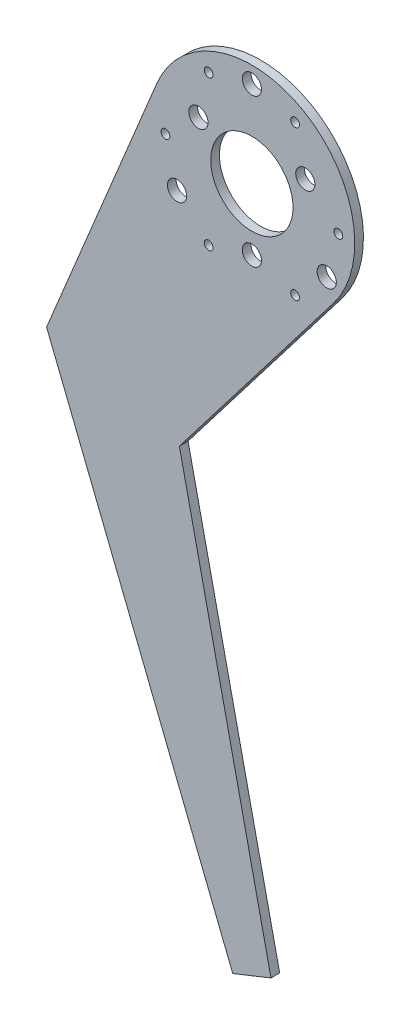
ISO-10303-21;
HEADER;
FILE_DESCRIPTION(('STEP AP214'),'2;1');
FILE_NAME('part.step','',(''),(''),'','','');
FILE_SCHEMA(('AUTOMOTIVE_DESIGN { 1 0 10303 214 1 1 1 1 }'));
ENDSEC;
DATA;
#1=APPLICATION_CONTEXT('core data for automotive mechanical design processes');
#2=APPLICATION_PROTOCOL_DEFINITION('international standard','automotive_design',2000,#1);
#3=PRODUCT_CONTEXT('',#1,'mechanical');
#4=PRODUCT('Part','Part','',(#3));
#5=PRODUCT_RELATED_PRODUCT_CATEGORY('part','',(#4));
#6=PRODUCT_DEFINITION_FORMATION('','',#4);
#7=PRODUCT_DEFINITION_CONTEXT('part definition',#1,'design');
#8=PRODUCT_DEFINITION('design','',#6,#7);
#9=PRODUCT_DEFINITION_SHAPE('','',#8);
#10=(LENGTH_UNIT() NAMED_UNIT(*) SI_UNIT(.MILLI.,.METRE.));
#11=(NAMED_UNIT(*) PLANE_ANGLE_UNIT() SI_UNIT($,.RADIAN.));
#12=(NAMED_UNIT(*) SI_UNIT($,.STERADIAN.) SOLID_ANGLE_UNIT());
#13=UNCERTAINTY_MEASURE_WITH_UNIT(LENGTH_MEASURE(1.E-05),#10,'distance_accuracy_value','');
#14=(GEOMETRIC_REPRESENTATION_CONTEXT(3) GLOBAL_UNCERTAINTY_ASSIGNED_CONTEXT((#13)) GLOBAL_UNIT_ASSIGNED_CONTEXT((#10,
#11,#12)) REPRESENTATION_CONTEXT('',''));
#15=CARTESIAN_POINT('',(0.,0.,0.));
#16=DIRECTION('',(0.,0.,1.));
#17=DIRECTION('',(1.,0.,0.));
#18=AXIS2_PLACEMENT_3D('',#15,#16,#17);
#19=CARTESIAN_POINT('',(0.,0.,7.35));
#20=DIRECTION('',(0.,0.,1.));
#21=DIRECTION('',(1.,0.,0.));
#22=AXIS2_PLACEMENT_3D('',#19,#20,#21);
#23=PLANE('',#22);
#24=CARTESIAN_POINT('',(27.2798002192098,-15.75,7.35));
#25=DIRECTION('',(0.,0.,1.));
#26=DIRECTION('',(1.,0.,0.));
#27=AXIS2_PLACEMENT_3D('',#24,#25,#26);
#28=CIRCLE('',#27,3.5);
#29=CARTESIAN_POINT('',(30.7798002192098,-15.75,7.35));
#30=VERTEX_POINT('',#29);
#31=EDGE_CURVE('E134',#30,#30,#28,.T.);
#32=ORIENTED_EDGE('',*,*,#31,.F.);
#33=EDGE_LOOP('',(#32));
#34=FACE_BOUND('',#33,.T.);
#35=CARTESIAN_POINT('',(-27.2798002192098,-15.75,7.35));
#36=DIRECTION('',(0.,0.,1.));
#37=DIRECTION('',(1.,0.,0.));
#38=AXIS2_PLACEMENT_3D('',#35,#36,#37);
#39=CIRCLE('',#38,3.5);
#40=CARTESIAN_POINT('',(-23.7798002192098,-15.75,7.35));
#41=VERTEX_POINT('',#40);
#42=EDGE_CURVE('E146',#41,#41,#39,.T.);
#43=ORIENTED_EDGE('',*,*,#42,.F.);
#44=EDGE_LOOP('',(#43));
#45=FACE_BOUND('',#44,.T.);
#46=CARTESIAN_POINT('',(0.,31.5,7.35));
#47=DIRECTION('',(0.,0.,1.));
#48=DIRECTION('',(1.,0.,0.));
#49=AXIS2_PLACEMENT_3D('',#46,#47,#48);
#50=CIRCLE('',#49,3.5);
#51=CARTESIAN_POINT('',(3.5,31.5,7.35));
#52=VERTEX_POINT('',#51);
#53=EDGE_CURVE('E158',#52,#52,#50,.T.);
#54=ORIENTED_EDGE('',*,*,#53,.F.);
#55=EDGE_LOOP('',(#54));
#56=FACE_BOUND('',#55,.T.);
#57=CARTESIAN_POINT('',(-31.5,0.,7.35));
#58=DIRECTION('',(0.,0.,1.));
#59=DIRECTION('',(1.,0.,0.));
#60=AXIS2_PLACEMENT_3D('',#57,#58,#59);
#61=CIRCLE('',#60,1.59999999999999);
#62=CARTESIAN_POINT('',(-29.9,0.,7.35));
#63=VERTEX_POINT('',#62);
#64=EDGE_CURVE('E170',#63,#63,#61,.T.);
#65=ORIENTED_EDGE('',*,*,#64,.F.);
#66=EDGE_LOOP('',(#65));
#67=FACE_BOUND('',#66,.T.);
#68=CARTESIAN_POINT('',(15.75,27.2798002192098,7.35));
#69=DIRECTION('',(0.,0.,1.));
#70=DIRECTION('',(1.,0.,0.));
#71=AXIS2_PLACEMENT_3D('',#68,#69,#70);
#72=CIRCLE('',#71,1.60000000000016);
#73=CARTESIAN_POINT('',(17.3500000000002,27.2798002192098,7.35));
#74=VERTEX_POINT('',#73);
#75=EDGE_CURVE('E182',#74,#74,#72,.T.);
#76=ORIENTED_EDGE('',*,*,#75,.F.);
#77=EDGE_LOOP('',(#76));
#78=FACE_BOUND('',#77,.T.);
#79=CARTESIAN_POINT('',(15.75,-27.2798002192098,7.35));
#80=DIRECTION('',(0.,0.,1.));
#81=DIRECTION('',(1.,0.,0.));
#82=AXIS2_PLACEMENT_3D('',#79,#80,#81);
#83=CIRCLE('',#82,1.60000000000004);
#84=CARTESIAN_POINT('',(17.35,-27.2798002192098,7.35));
#85=VERTEX_POINT('',#84);
#86=EDGE_CURVE('E194',#85,#85,#83,.T.);
#87=ORIENTED_EDGE('',*,*,#86,.F.);
#88=EDGE_LOOP('',(#87));
#89=FACE_BOUND('',#88,.T.);
#90=CARTESIAN_POINT('',(0.,0.,7.35));
#91=DIRECTION('',(0.,0.,1.));
#92=DIRECTION('',(1.,0.,0.));
#93=AXIS2_PLACEMENT_3D('',#90,#91,#92);
#94=CIRCLE('',#93,37.5);
#95=CARTESIAN_POINT('',(29.7507502609214,-22.828553587827,7.35));
#96=VERTEX_POINT('',#95);
#97=CARTESIAN_POINT('',(-34.6454824691732,14.350628713691,7.35));
#98=VERTEX_POINT('',#97);
#99=EDGE_CURVE('E11',#96,#98,#94,.T.);
#100=ORIENTED_EDGE('',*,*,#99,.T.);
#101=DIRECTION('',(-0.382683432365094,-0.923879532511285,0.));
#102=VECTOR('',#101,1.);
#103=CARTESIAN_POINT('',(-34.6454824691732,14.350628713691,7.35));
#104=LINE('',#103,#102);
#105=CARTESIAN_POINT('',(-74.827242867508,-82.6567221999939,7.35));
#106=VERTEX_POINT('',#105);
#107=EDGE_CURVE('E88',#98,#106,#104,.T.);
#108=ORIENTED_EDGE('',*,*,#107,.T.);
#109=DIRECTION('',(0.370506532215965,-0.928829860407868,0.));
#110=VECTOR('',#109,1.);
#111=CARTESIAN_POINT('',(-74.827242867508,-82.6567221999939,7.35));
#112=LINE('',#111,#110);
#113=CARTESIAN_POINT('',(-6.96622395305898,-252.77879899162,7.35));
#114=VERTEX_POINT('',#113);
#115=EDGE_CURVE('E96',#106,#114,#112,.T.);
#116=ORIENTED_EDGE('',*,*,#115,.T.);
#117=DIRECTION('',(0.928829860407877,0.370506532215943,0.));
#118=VECTOR('',#117,1.);
#119=CARTESIAN_POINT('',(-6.96622395305898,-252.77879899162,7.35));
#120=LINE('',#119,#118);
#121=CARTESIAN_POINT('',(6.96622395305914,-247.221201008381,7.35));
#122=VERTEX_POINT('',#121);
#123=EDGE_CURVE('E102',#114,#122,#120,.T.);
#124=ORIENTED_EDGE('',*,*,#123,.T.);
#125=DIRECTION('',(-0.215665843950661,0.976467226154083,0.));
#126=VECTOR('',#125,1.);
#127=CARTESIAN_POINT('',(6.96622395305914,-247.221201008381,7.35));
#128=LINE('',#127,#126);
#129=CARTESIAN_POINT('',(-26.4246581212801,-96.0377711212288,7.35));
#130=VERTEX_POINT('',#129);
#131=EDGE_CURVE('E112',#122,#130,#128,.T.);
#132=ORIENTED_EDGE('',*,*,#131,.T.);
#133=DIRECTION('',(0.608761429008719,0.793353340291236,0.));
#134=VECTOR('',#133,1.);
#135=CARTESIAN_POINT('',(-26.4246581212801,-96.0377711212288,7.35));
#136=LINE('',#135,#134);
#137=EDGE_CURVE('E115',#130,#96,#136,.T.);
#138=ORIENTED_EDGE('',*,*,#137,.T.);
#139=EDGE_LOOP('',(#100,#108,#116,#124,#132,#138));
#140=FACE_BOUND('',#139,.T.);
#141=CARTESIAN_POINT('',(0.,0.,7.35));
#142=DIRECTION('',(0.,0.,1.));
#143=DIRECTION('',(1.,0.,0.));
#144=AXIS2_PLACEMENT_3D('',#141,#142,#143);
#145=CIRCLE('',#144,15.);
#146=CARTESIAN_POINT('',(15.,0.,7.35));
#147=VERTEX_POINT('',#146);
#148=EDGE_CURVE('E200',#147,#147,#145,.T.);
#149=ORIENTED_EDGE('',*,*,#148,.F.);
#150=EDGE_LOOP('',(#149));
#151=FACE_BOUND('',#150,.T.);
#152=CARTESIAN_POINT('',(31.5,0.,7.35));
#153=DIRECTION('',(0.,0.,1.));
#154=DIRECTION('',(1.,0.,0.));
#155=AXIS2_PLACEMENT_3D('',#152,#153,#154);
#156=CIRCLE('',#155,1.5999999999999);
#157=CARTESIAN_POINT('',(33.0999999999999,0.,7.35));
#158=VERTEX_POINT('',#157);
#159=EDGE_CURVE('E188',#158,#158,#156,.T.);
#160=ORIENTED_EDGE('',*,*,#159,.F.);
#161=EDGE_LOOP('',(#160));
#162=FACE_BOUND('',#161,.T.);
#163=CARTESIAN_POINT('',(-15.75,27.2798002192098,7.35));
#164=DIRECTION('',(0.,0.,1.));
#165=DIRECTION('',(1.,0.,0.));
#166=AXIS2_PLACEMENT_3D('',#163,#164,#165);
#167=CIRCLE('',#166,1.60000000000015);
#168=CARTESIAN_POINT('',(-14.1499999999998,27.2798002192098,7.35));
#169=VERTEX_POINT('',#168);
#170=EDGE_CURVE('E176',#169,#169,#167,.T.);
#171=ORIENTED_EDGE('',*,*,#170,.F.);
#172=EDGE_LOOP('',(#171));
#173=FACE_BOUND('',#172,.T.);
#174=CARTESIAN_POINT('',(-15.75,-27.2798002192098,7.35));
#175=DIRECTION('',(0.,0.,1.));
#176=DIRECTION('',(1.,0.,0.));
#177=AXIS2_PLACEMENT_3D('',#174,#175,#176);
#178=CIRCLE('',#177,1.60000000000002);
#179=CARTESIAN_POINT('',(-14.15,-27.2798002192098,7.35));
#180=VERTEX_POINT('',#179);
#181=EDGE_CURVE('E164',#180,#180,#178,.T.);
#182=ORIENTED_EDGE('',*,*,#181,.F.);
#183=EDGE_LOOP('',(#182));
#184=FACE_BOUND('',#183,.T.);
#185=CARTESIAN_POINT('',(-19.4855715851498,11.25,7.35));
#186=DIRECTION('',(0.,0.,1.));
#187=DIRECTION('',(1.,0.,0.));
#188=AXIS2_PLACEMENT_3D('',#185,#186,#187);
#189=CIRCLE('',#188,3.5);
#190=CARTESIAN_POINT('',(-15.9855715851498,11.25,7.35));
#191=VERTEX_POINT('',#190);
#192=EDGE_CURVE('E152',#191,#191,#189,.T.);
#193=ORIENTED_EDGE('',*,*,#192,.F.);
#194=EDGE_LOOP('',(#193));
#195=FACE_BOUND('',#194,.T.);
#196=CARTESIAN_POINT('',(0.,-22.5,7.35));
#197=DIRECTION('',(0.,0.,1.));
#198=DIRECTION('',(1.,0.,0.));
#199=AXIS2_PLACEMENT_3D('',#196,#197,#198);
#200=CIRCLE('',#199,3.5);
#201=CARTESIAN_POINT('',(3.49999999999995,-22.5,7.35));
#202=VERTEX_POINT('',#201);
#203=EDGE_CURVE('E140',#202,#202,#200,.T.);
#204=ORIENTED_EDGE('',*,*,#203,.F.);
#205=EDGE_LOOP('',(#204));
#206=FACE_BOUND('',#205,.T.);
#207=CARTESIAN_POINT('',(19.4855715851499,11.25,7.35));
#208=DIRECTION('',(0.,0.,1.));
#209=DIRECTION('',(1.,0.,0.));
#210=AXIS2_PLACEMENT_3D('',#207,#208,#209);
#211=CIRCLE('',#210,3.5);
#212=CARTESIAN_POINT('',(22.9855715851499,11.25,7.35));
#213=VERTEX_POINT('',#212);
#214=EDGE_CURVE('E128',#213,#213,#211,.T.);
#215=ORIENTED_EDGE('',*,*,#214,.F.);
#216=EDGE_LOOP('',(#215));
#217=FACE_BOUND('',#216,.T.);
#218=ADVANCED_FACE('F33',(#34,#45,#56,#67,#78,#89,#140,#151,#162,#173,#184,#195,#206,#217),#23,.T.);
#219=CARTESIAN_POINT('',(0.,0.,4.175));
#220=DIRECTION('',(0.,0.,1.));
#221=DIRECTION('',(1.,0.,0.));
#222=AXIS2_PLACEMENT_3D('',#219,#220,#221);
#223=PLANE('',#222);
#224=CARTESIAN_POINT('',(0.,0.,4.175));
#225=DIRECTION('',(0.,0.,1.));
#226=DIRECTION('',(1.,0.,0.));
#227=AXIS2_PLACEMENT_3D('',#224,#225,#226);
#228=CIRCLE('',#227,37.5);
#229=CARTESIAN_POINT('',(29.7507502609214,-22.828553587827,4.17499999999998));
#230=VERTEX_POINT('',#229);
#231=CARTESIAN_POINT('',(-34.6454824691732,14.350628713691,4.175));
#232=VERTEX_POINT('',#231);
#233=EDGE_CURVE('E37',#230,#232,#228,.T.);
#234=ORIENTED_EDGE('',*,*,#233,.F.);
#235=DIRECTION('',(-0.608761429008719,-0.793353340291236,0.));
#236=VECTOR('',#235,1.);
#237=CARTESIAN_POINT('',(-26.4246581212801,-96.0377711212288,4.17499999999998));
#238=LINE('',#237,#236);
#239=CARTESIAN_POINT('',(-26.4246581212801,-96.0377711212288,4.17499999999998));
#240=VERTEX_POINT('',#239);
#241=EDGE_CURVE('E108',#230,#240,#238,.T.);
#242=ORIENTED_EDGE('',*,*,#241,.T.);
#243=DIRECTION('',(0.215665843950661,-0.976467226154083,0.));
#244=VECTOR('',#243,1.);
#245=CARTESIAN_POINT('',(6.96622395305914,-247.221201008381,4.17499999999998));
#246=LINE('',#245,#244);
#247=CARTESIAN_POINT('',(6.96622395305914,-247.221201008381,4.17499999999998));
#248=VERTEX_POINT('',#247);
#249=EDGE_CURVE('E450',#240,#248,#246,.T.);
#250=ORIENTED_EDGE('',*,*,#249,.T.);
#251=DIRECTION('',(-0.928829860407877,-0.370506532215943,0.));
#252=VECTOR('',#251,1.);
#253=CARTESIAN_POINT('',(-6.96622395305898,-252.77879899162,4.17499999999998));
#254=LINE('',#253,#252);
#255=CARTESIAN_POINT('',(-6.96622395305899,-252.77879899162,4.17499999999998));
#256=VERTEX_POINT('',#255);
#257=EDGE_CURVE('E447',#248,#256,#254,.T.);
#258=ORIENTED_EDGE('',*,*,#257,.T.);
#259=DIRECTION('',(-0.370506532215965,0.928829860407868,0.));
#260=VECTOR('',#259,1.);
#261=CARTESIAN_POINT('',(-74.827242867508,-82.6567221999939,4.17499999999998));
#262=LINE('',#261,#260);
#263=CARTESIAN_POINT('',(-74.827242867508,-82.6567221999939,4.17499999999998));
#264=VERTEX_POINT('',#263);
#265=EDGE_CURVE('E119',#256,#264,#262,.T.);
#266=ORIENTED_EDGE('',*,*,#265,.T.);
#267=DIRECTION('',(0.382683432365094,0.923879532511285,0.));
#268=VECTOR('',#267,1.);
#269=CARTESIAN_POINT('',(-34.6454824691732,14.350628713691,4.17499999999998));
#270=LINE('',#269,#268);
#271=EDGE_CURVE('E89',#264,#232,#270,.T.);
#272=ORIENTED_EDGE('',*,*,#271,.T.);
#273=EDGE_LOOP('',(#234,#242,#250,#258,#266,#272));
#274=FACE_BOUND('',#273,.T.);
#275=CARTESIAN_POINT('',(0.,0.,4.175));
#276=DIRECTION('',(0.,0.,1.));
#277=DIRECTION('',(1.,0.,0.));
#278=AXIS2_PLACEMENT_3D('',#275,#276,#277);
#279=CIRCLE('',#278,15.);
#280=CARTESIAN_POINT('',(15.,0.,4.175));
#281=VERTEX_POINT('',#280);
#282=EDGE_CURVE('E197',#281,#281,#279,.T.);
#283=ORIENTED_EDGE('',*,*,#282,.T.);
#284=EDGE_LOOP('',(#283));
#285=FACE_BOUND('',#284,.T.);
#286=CARTESIAN_POINT('',(15.75,-27.2798002192098,4.175));
#287=DIRECTION('',(0.,0.,1.));
#288=DIRECTION('',(1.,0.,0.));
#289=AXIS2_PLACEMENT_3D('',#286,#287,#288);
#290=CIRCLE('',#289,1.60000000000004);
#291=CARTESIAN_POINT('',(17.35,-27.2798002192098,4.175));
#292=VERTEX_POINT('',#291);
#293=EDGE_CURVE('E191',#292,#292,#290,.T.);
#294=ORIENTED_EDGE('',*,*,#293,.T.);
#295=EDGE_LOOP('',(#294));
#296=FACE_BOUND('',#295,.T.);
#297=CARTESIAN_POINT('',(31.5,0.,4.175));
#298=DIRECTION('',(0.,0.,1.));
#299=DIRECTION('',(1.,0.,0.));
#300=AXIS2_PLACEMENT_3D('',#297,#298,#299);
#301=CIRCLE('',#300,1.5999999999999);
#302=CARTESIAN_POINT('',(33.0999999999999,0.,4.175));
#303=VERTEX_POINT('',#302);
#304=EDGE_CURVE('E185',#303,#303,#301,.T.);
#305=ORIENTED_EDGE('',*,*,#304,.T.);
#306=EDGE_LOOP('',(#305));
#307=FACE_BOUND('',#306,.T.);
#308=CARTESIAN_POINT('',(15.75,27.2798002192098,4.175));
#309=DIRECTION('',(0.,0.,1.));
#310=DIRECTION('',(1.,0.,0.));
#311=AXIS2_PLACEMENT_3D('',#308,#309,#310);
#312=CIRCLE('',#311,1.60000000000016);
#313=CARTESIAN_POINT('',(17.3500000000002,27.2798002192098,4.175));
#314=VERTEX_POINT('',#313);
#315=EDGE_CURVE('E179',#314,#314,#312,.T.);
#316=ORIENTED_EDGE('',*,*,#315,.T.);
#317=EDGE_LOOP('',(#316));
#318=FACE_BOUND('',#317,.T.);
#319=CARTESIAN_POINT('',(-15.75,27.2798002192098,4.175));
#320=DIRECTION('',(0.,0.,1.));
#321=DIRECTION('',(1.,0.,0.));
#322=AXIS2_PLACEMENT_3D('',#319,#320,#321);
#323=CIRCLE('',#322,1.60000000000015);
#324=CARTESIAN_POINT('',(-14.1499999999998,27.2798002192098,4.175));
#325=VERTEX_POINT('',#324);
#326=EDGE_CURVE('E173',#325,#325,#323,.T.);
#327=ORIENTED_EDGE('',*,*,#326,.T.);
#328=EDGE_LOOP('',(#327));
#329=FACE_BOUND('',#328,.T.);
#330=CARTESIAN_POINT('',(-31.5,0.,4.175));
#331=DIRECTION('',(0.,0.,1.));
#332=DIRECTION('',(1.,0.,0.));
#333=AXIS2_PLACEMENT_3D('',#330,#331,#332);
#334=CIRCLE('',#333,1.59999999999999);
#335=CARTESIAN_POINT('',(-29.9,0.,4.175));
#336=VERTEX_POINT('',#335);
#337=EDGE_CURVE('E167',#336,#336,#334,.T.);
#338=ORIENTED_EDGE('',*,*,#337,.T.);
#339=EDGE_LOOP('',(#338));
#340=FACE_BOUND('',#339,.T.);
#341=CARTESIAN_POINT('',(-15.75,-27.2798002192098,4.175));
#342=DIRECTION('',(0.,0.,1.));
#343=DIRECTION('',(1.,0.,0.));
#344=AXIS2_PLACEMENT_3D('',#341,#342,#343);
#345=CIRCLE('',#344,1.60000000000002);
#346=CARTESIAN_POINT('',(-14.15,-27.2798002192098,4.175));
#347=VERTEX_POINT('',#346);
#348=EDGE_CURVE('E161',#347,#347,#345,.T.);
#349=ORIENTED_EDGE('',*,*,#348,.T.);
#350=EDGE_LOOP('',(#349));
#351=FACE_BOUND('',#350,.T.);
#352=CARTESIAN_POINT('',(0.,31.5,4.175));
#353=DIRECTION('',(0.,0.,1.));
#354=DIRECTION('',(1.,0.,0.));
#355=AXIS2_PLACEMENT_3D('',#352,#353,#354);
#356=CIRCLE('',#355,3.5);
#357=CARTESIAN_POINT('',(3.5,31.5,4.175));
#358=VERTEX_POINT('',#357);
#359=EDGE_CURVE('E155',#358,#358,#356,.T.);
#360=ORIENTED_EDGE('',*,*,#359,.T.);
#361=EDGE_LOOP('',(#360));
#362=FACE_BOUND('',#361,.T.);
#363=CARTESIAN_POINT('',(-19.4855715851498,11.25,4.175));
#364=DIRECTION('',(0.,0.,1.));
#365=DIRECTION('',(1.,0.,0.));
#366=AXIS2_PLACEMENT_3D('',#363,#364,#365);
#367=CIRCLE('',#366,3.5);
#368=CARTESIAN_POINT('',(-15.9855715851498,11.25,4.175));
#369=VERTEX_POINT('',#368);
#370=EDGE_CURVE('E149',#369,#369,#367,.T.);
#371=ORIENTED_EDGE('',*,*,#370,.T.);
#372=EDGE_LOOP('',(#371));
#373=FACE_BOUND('',#372,.T.);
#374=CARTESIAN_POINT('',(-27.2798002192098,-15.75,4.175));
#375=DIRECTION('',(0.,0.,1.));
#376=DIRECTION('',(1.,0.,0.));
#377=AXIS2_PLACEMENT_3D('',#374,#375,#376);
#378=CIRCLE('',#377,3.5);
#379=CARTESIAN_POINT('',(-23.7798002192098,-15.75,4.175));
#380=VERTEX_POINT('',#379);
#381=EDGE_CURVE('E143',#380,#380,#378,.T.);
#382=ORIENTED_EDGE('',*,*,#381,.T.);
#383=EDGE_LOOP('',(#382));
#384=FACE_BOUND('',#383,.T.);
#385=CARTESIAN_POINT('',(0.,-22.5,4.175));
#386=DIRECTION('',(0.,0.,1.));
#387=DIRECTION('',(1.,0.,0.));
#388=AXIS2_PLACEMENT_3D('',#385,#386,#387);
#389=CIRCLE('',#388,3.5);
#390=CARTESIAN_POINT('',(3.49999999999995,-22.5,4.175));
#391=VERTEX_POINT('',#390);
#392=EDGE_CURVE('E137',#391,#391,#389,.T.);
#393=ORIENTED_EDGE('',*,*,#392,.T.);
#394=EDGE_LOOP('',(#393));
#395=FACE_BOUND('',#394,.T.);
#396=CARTESIAN_POINT('',(27.2798002192098,-15.75,4.175));
#397=DIRECTION('',(0.,0.,1.));
#398=DIRECTION('',(1.,0.,0.));
#399=AXIS2_PLACEMENT_3D('',#396,#397,#398);
#400=CIRCLE('',#399,3.5);
#401=CARTESIAN_POINT('',(30.7798002192098,-15.75,4.175));
#402=VERTEX_POINT('',#401);
#403=EDGE_CURVE('E131',#402,#402,#400,.T.);
#404=ORIENTED_EDGE('',*,*,#403,.T.);
#405=EDGE_LOOP('',(#404));
#406=FACE_BOUND('',#405,.T.);
#407=CARTESIAN_POINT('',(19.4855715851499,11.25,4.175));
#408=DIRECTION('',(0.,0.,1.));
#409=DIRECTION('',(1.,0.,0.));
#410=AXIS2_PLACEMENT_3D('',#407,#408,#409);
#411=CIRCLE('',#410,3.5);
#412=CARTESIAN_POINT('',(22.9855715851499,11.25,4.175));
#413=VERTEX_POINT('',#412);
#414=EDGE_CURVE('E127',#413,#413,#411,.T.);
#415=ORIENTED_EDGE('',*,*,#414,.T.);
#416=EDGE_LOOP('',(#415));
#417=FACE_BOUND('',#416,.T.);
#418=ADVANCED_FACE('F206',(#274,#285,#296,#307,#318,#329,#340,#351,#362,#373,#384,#395,#406,
#417),#223,.F.);
#419=CARTESIAN_POINT('',(0.,0.,7.35));
#420=DIRECTION('',(0.,0.,-1.));
#421=DIRECTION('',(-1.,0.,0.));
#422=AXIS2_PLACEMENT_3D('',#419,#420,#421);
#423=CYLINDRICAL_SURFACE('',#422,37.5);
#424=ORIENTED_EDGE('',*,*,#99,.F.);
#425=DIRECTION('',(0.,0.,1.));
#426=VECTOR('',#425,1.);
#427=CARTESIAN_POINT('',(29.7507502609214,-22.828553587827,-282.695507011329));
#428=LINE('',#427,#426);
#429=EDGE_CURVE('E117',#230,#96,#428,.T.);
#430=ORIENTED_EDGE('',*,*,#429,.F.);
#431=ORIENTED_EDGE('',*,*,#233,.T.);
#432=DIRECTION('',(0.,0.,1.));
#433=VECTOR('',#432,1.);
#434=CARTESIAN_POINT('',(-34.6454824691732,14.350628713691,-282.695507011329));
#435=LINE('',#434,#433);
#436=EDGE_CURVE('E93',#232,#98,#435,.T.);
#437=ORIENTED_EDGE('',*,*,#436,.T.);
#438=EDGE_LOOP('',(#424,#430,#431,#437));
#439=FACE_BOUND('',#438,.T.);
#440=ADVANCED_FACE('F35',(#439),#423,.T.);
#441=CARTESIAN_POINT('',(0.,0.,7.35));
#442=DIRECTION('',(0.,0.,-1.));
#443=DIRECTION('',(-1.,0.,0.));
#444=AXIS2_PLACEMENT_3D('',#441,#442,#443);
#445=CYLINDRICAL_SURFACE('',#444,15.);
#446=ORIENTED_EDGE('',*,*,#148,.T.);
#447=EDGE_LOOP('',(#446));
#448=FACE_BOUND('',#447,.T.);
#449=ORIENTED_EDGE('',*,*,#282,.F.);
#450=EDGE_LOOP('',(#449));
#451=FACE_BOUND('',#450,.T.);
#452=ADVANCED_FACE('F209',(#448,#451),#445,.F.);
#453=CARTESIAN_POINT('',(15.75,-27.2798002192098,7.35));
#454=DIRECTION('',(0.,0.,-1.));
#455=DIRECTION('',(-1.,0.,0.));
#456=AXIS2_PLACEMENT_3D('',#453,#454,#455);
#457=CYLINDRICAL_SURFACE('',#456,1.60000000000004);
#458=ORIENTED_EDGE('',*,*,#86,.T.);
#459=EDGE_LOOP('',(#458));
#460=FACE_BOUND('',#459,.T.);
#461=ORIENTED_EDGE('',*,*,#293,.F.);
#462=EDGE_LOOP('',(#461));
#463=FACE_BOUND('',#462,.T.);
#464=ADVANCED_FACE('F211',(#460,#463),#457,.F.);
#465=CARTESIAN_POINT('',(31.5,0.,7.35));
#466=DIRECTION('',(0.,0.,-1.));
#467=DIRECTION('',(-1.,0.,0.));
#468=AXIS2_PLACEMENT_3D('',#465,#466,#467);
#469=CYLINDRICAL_SURFACE('',#468,1.5999999999999);
#470=ORIENTED_EDGE('',*,*,#159,.T.);
#471=EDGE_LOOP('',(#470));
#472=FACE_BOUND('',#471,.T.);
#473=ORIENTED_EDGE('',*,*,#304,.F.);
#474=EDGE_LOOP('',(#473));
#475=FACE_BOUND('',#474,.T.);
#476=ADVANCED_FACE('F218',(#472,#475),#469,.F.);
#477=CARTESIAN_POINT('',(15.75,27.2798002192098,7.35));
#478=DIRECTION('',(0.,0.,-1.));
#479=DIRECTION('',(-1.,0.,0.));
#480=AXIS2_PLACEMENT_3D('',#477,#478,#479);
#481=CYLINDRICAL_SURFACE('',#480,1.60000000000016);
#482=ORIENTED_EDGE('',*,*,#75,.T.);
#483=EDGE_LOOP('',(#482));
#484=FACE_BOUND('',#483,.T.);
#485=ORIENTED_EDGE('',*,*,#315,.F.);
#486=EDGE_LOOP('',(#485));
#487=FACE_BOUND('',#486,.T.);
#488=ADVANCED_FACE('F309',(#484,#487),#481,.F.);
#489=CARTESIAN_POINT('',(-15.75,27.2798002192098,7.35));
#490=DIRECTION('',(0.,0.,-1.));
#491=DIRECTION('',(-1.,0.,0.));
#492=AXIS2_PLACEMENT_3D('',#489,#490,#491);
#493=CYLINDRICAL_SURFACE('',#492,1.60000000000015);
#494=ORIENTED_EDGE('',*,*,#170,.T.);
#495=EDGE_LOOP('',(#494));
#496=FACE_BOUND('',#495,.T.);
#497=ORIENTED_EDGE('',*,*,#326,.F.);
#498=EDGE_LOOP('',(#497));
#499=FACE_BOUND('',#498,.T.);
#500=ADVANCED_FACE('F305',(#496,#499),#493,.F.);
#501=CARTESIAN_POINT('',(-31.5,0.,7.35));
#502=DIRECTION('',(0.,0.,-1.));
#503=DIRECTION('',(-1.,0.,0.));
#504=AXIS2_PLACEMENT_3D('',#501,#502,#503);
#505=CYLINDRICAL_SURFACE('',#504,1.59999999999999);
#506=ORIENTED_EDGE('',*,*,#64,.T.);
#507=EDGE_LOOP('',(#506));
#508=FACE_BOUND('',#507,.T.);
#509=ORIENTED_EDGE('',*,*,#337,.F.);
#510=EDGE_LOOP('',(#509));
#511=FACE_BOUND('',#510,.T.);
#512=ADVANCED_FACE('F301',(#508,#511),#505,.F.);
#513=CARTESIAN_POINT('',(-15.75,-27.2798002192098,7.35));
#514=DIRECTION('',(0.,0.,-1.));
#515=DIRECTION('',(-1.,0.,0.));
#516=AXIS2_PLACEMENT_3D('',#513,#514,#515);
#517=CYLINDRICAL_SURFACE('',#516,1.60000000000002);
#518=ORIENTED_EDGE('',*,*,#181,.T.);
#519=EDGE_LOOP('',(#518));
#520=FACE_BOUND('',#519,.T.);
#521=ORIENTED_EDGE('',*,*,#348,.F.);
#522=EDGE_LOOP('',(#521));
#523=FACE_BOUND('',#522,.T.);
#524=ADVANCED_FACE('F297',(#520,#523),#517,.F.);
#525=CARTESIAN_POINT('',(0.,31.5,7.35));
#526=DIRECTION('',(0.,0.,-1.));
#527=DIRECTION('',(-1.,0.,0.));
#528=AXIS2_PLACEMENT_3D('',#525,#526,#527);
#529=CYLINDRICAL_SURFACE('',#528,3.5);
#530=ORIENTED_EDGE('',*,*,#53,.T.);
#531=EDGE_LOOP('',(#530));
#532=FACE_BOUND('',#531,.T.);
#533=ORIENTED_EDGE('',*,*,#359,.F.);
#534=EDGE_LOOP('',(#533));
#535=FACE_BOUND('',#534,.T.);
#536=ADVANCED_FACE('F293',(#532,#535),#529,.F.);
#537=CARTESIAN_POINT('',(-19.4855715851498,11.25,7.35));
#538=DIRECTION('',(0.,0.,-1.));
#539=DIRECTION('',(-1.,0.,0.));
#540=AXIS2_PLACEMENT_3D('',#537,#538,#539);
#541=CYLINDRICAL_SURFACE('',#540,3.5);
#542=ORIENTED_EDGE('',*,*,#192,.T.);
#543=EDGE_LOOP('',(#542));
#544=FACE_BOUND('',#543,.T.);
#545=ORIENTED_EDGE('',*,*,#370,.F.);
#546=EDGE_LOOP('',(#545));
#547=FACE_BOUND('',#546,.T.);
#548=ADVANCED_FACE('F289',(#544,#547),#541,.F.);
#549=CARTESIAN_POINT('',(-27.2798002192098,-15.75,7.35));
#550=DIRECTION('',(0.,0.,-1.));
#551=DIRECTION('',(-1.,0.,0.));
#552=AXIS2_PLACEMENT_3D('',#549,#550,#551);
#553=CYLINDRICAL_SURFACE('',#552,3.5);
#554=ORIENTED_EDGE('',*,*,#42,.T.);
#555=EDGE_LOOP('',(#554));
#556=FACE_BOUND('',#555,.T.);
#557=ORIENTED_EDGE('',*,*,#381,.F.);
#558=EDGE_LOOP('',(#557));
#559=FACE_BOUND('',#558,.T.);
#560=ADVANCED_FACE('F285',(#556,#559),#553,.F.);
#561=CARTESIAN_POINT('',(0.,-22.5,7.35));
#562=DIRECTION('',(0.,0.,-1.));
#563=DIRECTION('',(-1.,0.,0.));
#564=AXIS2_PLACEMENT_3D('',#561,#562,#563);
#565=CYLINDRICAL_SURFACE('',#564,3.5);
#566=ORIENTED_EDGE('',*,*,#203,.T.);
#567=EDGE_LOOP('',(#566));
#568=FACE_BOUND('',#567,.T.);
#569=ORIENTED_EDGE('',*,*,#392,.F.);
#570=EDGE_LOOP('',(#569));
#571=FACE_BOUND('',#570,.T.);
#572=ADVANCED_FACE('F277',(#568,#571),#565,.F.);
#573=CARTESIAN_POINT('',(27.2798002192098,-15.75,7.35));
#574=DIRECTION('',(0.,0.,-1.));
#575=DIRECTION('',(-1.,0.,0.));
#576=AXIS2_PLACEMENT_3D('',#573,#574,#575);
#577=CYLINDRICAL_SURFACE('',#576,3.5);
#578=ORIENTED_EDGE('',*,*,#31,.T.);
#579=EDGE_LOOP('',(#578));
#580=FACE_BOUND('',#579,.T.);
#581=ORIENTED_EDGE('',*,*,#403,.F.);
#582=EDGE_LOOP('',(#581));
#583=FACE_BOUND('',#582,.T.);
#584=ADVANCED_FACE('F267',(#580,#583),#577,.F.);
#585=CARTESIAN_POINT('',(19.4855715851499,11.25,7.35));
#586=DIRECTION('',(0.,0.,-1.));
#587=DIRECTION('',(-1.,0.,0.));
#588=AXIS2_PLACEMENT_3D('',#585,#586,#587);
#589=CYLINDRICAL_SURFACE('',#588,3.5);
#590=ORIENTED_EDGE('',*,*,#214,.T.);
#591=EDGE_LOOP('',(#590));
#592=FACE_BOUND('',#591,.T.);
#593=ORIENTED_EDGE('',*,*,#414,.F.);
#594=EDGE_LOOP('',(#593));
#595=FACE_BOUND('',#594,.T.);
#596=ADVANCED_FACE('F264',(#592,#595),#589,.F.);
#597=CARTESIAN_POINT('',(-26.4246581212801,-96.0377711212288,-282.695507011329));
#598=DIRECTION('',(0.793353340291236,-0.608761429008719,0.));
#599=DIRECTION('',(0.608761429008719,0.793353340291236,0.));
#600=AXIS2_PLACEMENT_3D('',#597,#598,#599);
#601=PLANE('',#600);
#602=ORIENTED_EDGE('',*,*,#241,.F.);
#603=ORIENTED_EDGE('',*,*,#429,.T.);
#604=ORIENTED_EDGE('',*,*,#137,.F.);
#605=DIRECTION('',(0.,0.,1.));
#606=VECTOR('',#605,1.);
#607=CARTESIAN_POINT('',(-26.4246581212801,-96.0377711212288,-282.695507011329));
#608=LINE('',#607,#606);
#609=EDGE_CURVE('E120',#240,#130,#608,.T.);
#610=ORIENTED_EDGE('',*,*,#609,.F.);
#611=EDGE_LOOP('',(#602,#603,#604,#610));
#612=FACE_BOUND('',#611,.T.);
#613=ADVANCED_FACE('F266',(#612),#601,.T.);
#614=CARTESIAN_POINT('',(6.96622395305914,-247.221201008381,-282.695507011329));
#615=DIRECTION('',(0.976467226154083,0.215665843950661,0.));
#616=DIRECTION('',(-0.215665843950661,0.976467226154083,0.));
#617=AXIS2_PLACEMENT_3D('',#614,#615,#616);
#618=PLANE('',#617);
#619=ORIENTED_EDGE('',*,*,#249,.F.);
#620=ORIENTED_EDGE('',*,*,#609,.T.);
#621=ORIENTED_EDGE('',*,*,#131,.F.);
#622=DIRECTION('',(0.,0.,1.));
#623=VECTOR('',#622,1.);
#624=CARTESIAN_POINT('',(6.96622395305914,-247.221201008381,-282.695507011329));
#625=LINE('',#624,#623);
#626=EDGE_CURVE('E122',#248,#122,#625,.T.);
#627=ORIENTED_EDGE('',*,*,#626,.F.);
#628=EDGE_LOOP('',(#619,#620,#621,#627));
#629=FACE_BOUND('',#628,.T.);
#630=ADVANCED_FACE('F274',(#629),#618,.T.);
#631=CARTESIAN_POINT('',(-6.96622395305898,-252.77879899162,-282.695507011329));
#632=DIRECTION('',(0.370506532215943,-0.928829860407877,0.));
#633=DIRECTION('',(0.928829860407877,0.370506532215943,0.));
#634=AXIS2_PLACEMENT_3D('',#631,#632,#633);
#635=PLANE('',#634);
#636=ORIENTED_EDGE('',*,*,#257,.F.);
#637=ORIENTED_EDGE('',*,*,#626,.T.);
#638=ORIENTED_EDGE('',*,*,#123,.F.);
#639=DIRECTION('',(0.,0.,1.));
#640=VECTOR('',#639,1.);
#641=CARTESIAN_POINT('',(-6.96622395305898,-252.77879899162,-282.695507011329));
#642=LINE('',#641,#640);
#643=EDGE_CURVE('E92',#256,#114,#642,.T.);
#644=ORIENTED_EDGE('',*,*,#643,.F.);
#645=EDGE_LOOP('',(#636,#637,#638,#644));
#646=FACE_BOUND('',#645,.T.);
#647=ADVANCED_FACE('F418',(#646),#635,.T.);
#648=CARTESIAN_POINT('',(-74.827242867508,-82.6567221999939,-282.695507011329));
#649=DIRECTION('',(-0.928829860407868,-0.370506532215965,0.));
#650=DIRECTION('',(0.370506532215965,-0.928829860407868,0.));
#651=AXIS2_PLACEMENT_3D('',#648,#649,#650);
#652=PLANE('',#651);
#653=ORIENTED_EDGE('',*,*,#265,.F.);
#654=ORIENTED_EDGE('',*,*,#643,.T.);
#655=ORIENTED_EDGE('',*,*,#115,.F.);
#656=DIRECTION('',(0.,0.,1.));
#657=VECTOR('',#656,1.);
#658=CARTESIAN_POINT('',(-74.827242867508,-82.6567221999939,-282.695507011329));
#659=LINE('',#658,#657);
#660=EDGE_CURVE('E83',#264,#106,#659,.T.);
#661=ORIENTED_EDGE('',*,*,#660,.F.);
#662=EDGE_LOOP('',(#653,#654,#655,#661));
#663=FACE_BOUND('',#662,.T.);
#664=ADVANCED_FACE('F97',(#663),#652,.T.);
#665=CARTESIAN_POINT('',(-34.6454824691732,14.350628713691,-282.695507011329));
#666=DIRECTION('',(-0.923879532511285,0.382683432365094,0.));
#667=DIRECTION('',(-0.382683432365094,-0.923879532511285,0.));
#668=AXIS2_PLACEMENT_3D('',#665,#666,#667);
#669=PLANE('',#668);
#670=ORIENTED_EDGE('',*,*,#271,.F.);
#671=ORIENTED_EDGE('',*,*,#660,.T.);
#672=ORIENTED_EDGE('',*,*,#107,.F.);
#673=ORIENTED_EDGE('',*,*,#436,.F.);
#674=EDGE_LOOP('',(#670,#671,#672,#673));
#675=FACE_BOUND('',#674,.T.);
#676=ADVANCED_FACE('F85',(#675),#669,.T.);
#677=CLOSED_SHELL('',(#218,#418,#440,#452,#464,#476,#488,#500,#512,#524,#536,#548,#560,#572,
#584,#596,#613,#630,#647,#664,#676));
#678=MANIFOLD_SOLID_BREP('B2',#677);
#679=ADVANCED_BREP_SHAPE_REPRESENTATION('',(#18,#678),#14);
#680=SHAPE_DEFINITION_REPRESENTATION(#9,#679);
ENDSEC;
END-ISO-10303-21;
